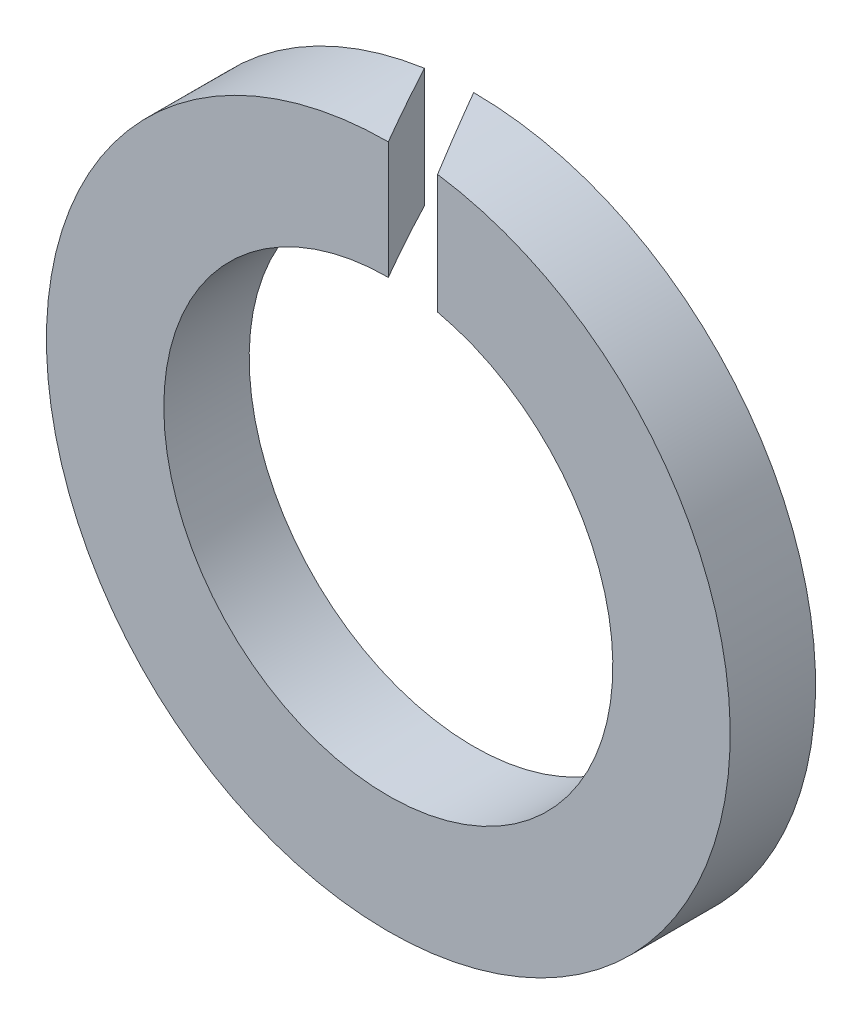
ISO-10303-21;
HEADER;
FILE_DESCRIPTION(('STEP AP214'),'2;1');
FILE_NAME('part.step','',(''),(''),'','','');
FILE_SCHEMA(('AUTOMOTIVE_DESIGN { 1 0 10303 214 1 1 1 1 }'));
ENDSEC;
DATA;
#1=APPLICATION_CONTEXT('core data for automotive mechanical design processes');
#2=APPLICATION_PROTOCOL_DEFINITION('international standard','automotive_design',2000,#1);
#3=PRODUCT_CONTEXT('',#1,'mechanical');
#4=PRODUCT('Part','Part','',(#3));
#5=PRODUCT_RELATED_PRODUCT_CATEGORY('part','',(#4));
#6=PRODUCT_DEFINITION_FORMATION('','',#4);
#7=PRODUCT_DEFINITION_CONTEXT('part definition',#1,'design');
#8=PRODUCT_DEFINITION('design','',#6,#7);
#9=PRODUCT_DEFINITION_SHAPE('','',#8);
#10=(LENGTH_UNIT() NAMED_UNIT(*) SI_UNIT(.MILLI.,.METRE.));
#11=(NAMED_UNIT(*) PLANE_ANGLE_UNIT() SI_UNIT($,.RADIAN.));
#12=(NAMED_UNIT(*) SI_UNIT($,.STERADIAN.) SOLID_ANGLE_UNIT());
#13=UNCERTAINTY_MEASURE_WITH_UNIT(LENGTH_MEASURE(1.E-05),#10,'distance_accuracy_value','');
#14=(GEOMETRIC_REPRESENTATION_CONTEXT(3) GLOBAL_UNCERTAINTY_ASSIGNED_CONTEXT((#13)) GLOBAL_UNIT_ASSIGNED_CONTEXT((#10,
#11,#12)) REPRESENTATION_CONTEXT('',''));
#15=CARTESIAN_POINT('',(0.,0.,0.));
#16=DIRECTION('',(0.,0.,1.));
#17=DIRECTION('',(1.,0.,0.));
#18=AXIS2_PLACEMENT_3D('',#15,#16,#17);
#19=CARTESIAN_POINT('',(0.,0.,-4.));
#20=DIRECTION('',(0.,0.,1.));
#21=DIRECTION('',(1.,0.,0.));
#22=AXIS2_PLACEMENT_3D('',#19,#20,#21);
#23=CYLINDRICAL_SURFACE('',#22,16.02);
#24=CARTESIAN_POINT('',(0.,0.,-3.99999999999998));
#25=DIRECTION('',(-0.866025403784437,0.,0.500000000000003));
#26=DIRECTION('',(0.500000000000003,0.,0.866025403784437));
#27=AXIS2_PLACEMENT_3D('',#24,#25,#26);
#28=ELLIPSE('',#27,32.0399999999998,16.02);
#29=CARTESIAN_POINT('',(0.,16.02,-4.));
#30=VERTEX_POINT('',#29);
#31=CARTESIAN_POINT('',(2.3094010767585,15.8526674937269,0.));
#32=VERTEX_POINT('',#31);
#33=EDGE_CURVE('E40',#30,#32,#28,.F.);
#34=ORIENTED_EDGE('',*,*,#33,.T.);
#35=CARTESIAN_POINT('',(0.,0.,0.));
#36=DIRECTION('',(0.,0.,1.));
#37=DIRECTION('',(1.,0.,0.));
#38=AXIS2_PLACEMENT_3D('',#35,#36,#37);
#39=CIRCLE('',#38,16.02);
#40=CARTESIAN_POINT('',(0.,16.02,0.));
#41=VERTEX_POINT('',#40);
#42=EDGE_CURVE('E46',#41,#32,#39,.T.);
#43=ORIENTED_EDGE('',*,*,#42,.F.);
#44=CARTESIAN_POINT('',(0.,0.,0.));
#45=DIRECTION('',(0.86602540378444,0.,-0.499999999999997));
#46=DIRECTION('',(0.499999999999997,0.,0.86602540378444));
#47=AXIS2_PLACEMENT_3D('',#44,#45,#46);
#48=ELLIPSE('',#47,32.0400000000002,16.02);
#49=CARTESIAN_POINT('',(-2.30940107675848,15.8526674937269,-4.));
#50=VERTEX_POINT('',#49);
#51=EDGE_CURVE('E54',#50,#41,#48,.T.);
#52=ORIENTED_EDGE('',*,*,#51,.F.);
#53=CARTESIAN_POINT('',(0.,0.,-4.));
#54=DIRECTION('',(0.,0.,1.));
#55=DIRECTION('',(1.,0.,0.));
#56=AXIS2_PLACEMENT_3D('',#53,#54,#55);
#57=CIRCLE('',#56,16.02);
#58=EDGE_CURVE('E11',#50,#30,#57,.T.);
#59=ORIENTED_EDGE('',*,*,#58,.T.);
#60=EDGE_LOOP('',(#34,#43,#52,#59));
#61=FACE_BOUND('',#60,.T.);
#62=ADVANCED_FACE('F36',(#61),#23,.T.);
#63=CARTESIAN_POINT('',(16.02,0.,-4.));
#64=DIRECTION('',(0.,0.,-1.));
#65=DIRECTION('',(-1.,0.,0.));
#66=AXIS2_PLACEMENT_3D('',#63,#64,#65);
#67=PLANE('',#66);
#68=CARTESIAN_POINT('',(0.,0.,-4.));
#69=DIRECTION('',(0.,0.,-1.));
#70=DIRECTION('',(-1.,0.,0.));
#71=AXIS2_PLACEMENT_3D('',#68,#69,#70);
#72=CIRCLE('',#71,10.52);
#73=CARTESIAN_POINT('',(0.,10.52,-4.));
#74=VERTEX_POINT('',#73);
#75=CARTESIAN_POINT('',(-2.30940107675848,10.2633847568269,-4.));
#76=VERTEX_POINT('',#75);
#77=EDGE_CURVE('E68',#74,#76,#72,.T.);
#78=ORIENTED_EDGE('',*,*,#77,.F.);
#79=DIRECTION('',(0.,-1.,0.));
#80=VECTOR('',#79,1.);
#81=CARTESIAN_POINT('',(0.,10.2633847568269,-4.));
#82=LINE('',#81,#80);
#83=EDGE_CURVE('E90',#74,#30,#82,.F.);
#84=ORIENTED_EDGE('',*,*,#83,.T.);
#85=ORIENTED_EDGE('',*,*,#58,.F.);
#86=DIRECTION('',(0.,1.,0.));
#87=VECTOR('',#86,1.);
#88=CARTESIAN_POINT('',(-2.30940107675848,16.02,-4.));
#89=LINE('',#88,#87);
#90=EDGE_CURVE('E85',#50,#76,#89,.F.);
#91=ORIENTED_EDGE('',*,*,#90,.T.);
#92=EDGE_LOOP('',(#78,#84,#85,#91));
#93=FACE_BOUND('',#92,.T.);
#94=ADVANCED_FACE('F89',(#93),#67,.T.);
#95=CARTESIAN_POINT('',(0.,0.,0.));
#96=DIRECTION('',(0.,0.,1.));
#97=DIRECTION('',(1.,0.,0.));
#98=AXIS2_PLACEMENT_3D('',#95,#96,#97);
#99=PLANE('',#98);
#100=CARTESIAN_POINT('',(0.,0.,0.));
#101=DIRECTION('',(0.,0.,-1.));
#102=DIRECTION('',(-1.,0.,0.));
#103=AXIS2_PLACEMENT_3D('',#100,#101,#102);
#104=CIRCLE('',#103,10.52);
#105=CARTESIAN_POINT('',(2.3094010767585,10.2633847568269,0.));
#106=VERTEX_POINT('',#105);
#107=CARTESIAN_POINT('',(0.,10.52,0.));
#108=VERTEX_POINT('',#107);
#109=EDGE_CURVE('E82',#106,#108,#104,.T.);
#110=ORIENTED_EDGE('',*,*,#109,.T.);
#111=DIRECTION('',(0.,-1.,0.));
#112=VECTOR('',#111,1.);
#113=CARTESIAN_POINT('',(0.,16.02,0.));
#114=LINE('',#113,#112);
#115=EDGE_CURVE('E86',#41,#108,#114,.T.);
#116=ORIENTED_EDGE('',*,*,#115,.F.);
#117=ORIENTED_EDGE('',*,*,#42,.T.);
#118=DIRECTION('',(0.,1.,0.));
#119=VECTOR('',#118,1.);
#120=CARTESIAN_POINT('',(2.3094010767585,10.2633847568269,0.));
#121=LINE('',#120,#119);
#122=EDGE_CURVE('E91',#106,#32,#121,.T.);
#123=ORIENTED_EDGE('',*,*,#122,.F.);
#124=EDGE_LOOP('',(#110,#116,#117,#123));
#125=FACE_BOUND('',#124,.T.);
#126=ADVANCED_FACE('F108',(#125),#99,.T.);
#127=CARTESIAN_POINT('',(2.3094010767585,10.2633847568269,0.));
#128=DIRECTION('',(-0.866025403784437,0.,0.500000000000003));
#129=DIRECTION('',(0.500000000000003,0.,0.866025403784437));
#130=AXIS2_PLACEMENT_3D('',#127,#128,#129);
#131=PLANE('',#130);
#132=ORIENTED_EDGE('',*,*,#122,.T.);
#133=ORIENTED_EDGE('',*,*,#33,.F.);
#134=ORIENTED_EDGE('',*,*,#83,.F.);
#135=CARTESIAN_POINT('',(0.,0.,-3.99999999999998));
#136=DIRECTION('',(-0.866025403784437,0.,0.500000000000003));
#137=DIRECTION('',(0.500000000000003,0.,0.866025403784437));
#138=AXIS2_PLACEMENT_3D('',#135,#136,#137);
#139=ELLIPSE('',#138,21.0399999999999,10.52);
#140=EDGE_CURVE('E77',#74,#106,#139,.F.);
#141=ORIENTED_EDGE('',*,*,#140,.T.);
#142=EDGE_LOOP('',(#132,#133,#134,#141));
#143=FACE_BOUND('',#142,.T.);
#144=ADVANCED_FACE('F38',(#143),#131,.T.);
#145=CARTESIAN_POINT('',(0.,16.02,0.));
#146=DIRECTION('',(0.86602540378444,0.,-0.499999999999997));
#147=DIRECTION('',(-0.499999999999997,0.,-0.86602540378444));
#148=AXIS2_PLACEMENT_3D('',#145,#146,#147);
#149=PLANE('',#148);
#150=ORIENTED_EDGE('',*,*,#115,.T.);
#151=CARTESIAN_POINT('',(0.,0.,0.));
#152=DIRECTION('',(0.86602540378444,0.,-0.499999999999997));
#153=DIRECTION('',(0.499999999999997,0.,0.86602540378444));
#154=AXIS2_PLACEMENT_3D('',#151,#152,#153);
#155=ELLIPSE('',#154,21.0400000000001,10.52);
#156=EDGE_CURVE('E73',#76,#108,#155,.T.);
#157=ORIENTED_EDGE('',*,*,#156,.F.);
#158=ORIENTED_EDGE('',*,*,#90,.F.);
#159=ORIENTED_EDGE('',*,*,#51,.T.);
#160=EDGE_LOOP('',(#150,#157,#158,#159));
#161=FACE_BOUND('',#160,.T.);
#162=ADVANCED_FACE('F84',(#161),#149,.T.);
#163=CARTESIAN_POINT('',(0.,0.,0.));
#164=DIRECTION('',(0.,0.,-1.));
#165=DIRECTION('',(-1.,0.,0.));
#166=AXIS2_PLACEMENT_3D('',#163,#164,#165);
#167=CYLINDRICAL_SURFACE('',#166,10.52);
#168=ORIENTED_EDGE('',*,*,#77,.T.);
#169=ORIENTED_EDGE('',*,*,#156,.T.);
#170=ORIENTED_EDGE('',*,*,#109,.F.);
#171=ORIENTED_EDGE('',*,*,#140,.F.);
#172=EDGE_LOOP('',(#168,#169,#170,#171));
#173=FACE_BOUND('',#172,.T.);
#174=ADVANCED_FACE('F70',(#173),#167,.F.);
#175=CLOSED_SHELL('',(#62,#94,#126,#144,#162,#174));
#176=MANIFOLD_SOLID_BREP('B2',#175);
#177=ADVANCED_BREP_SHAPE_REPRESENTATION('',(#18,#176),#14);
#178=SHAPE_DEFINITION_REPRESENTATION(#9,#177);
ENDSEC;
END-ISO-10303-21;
